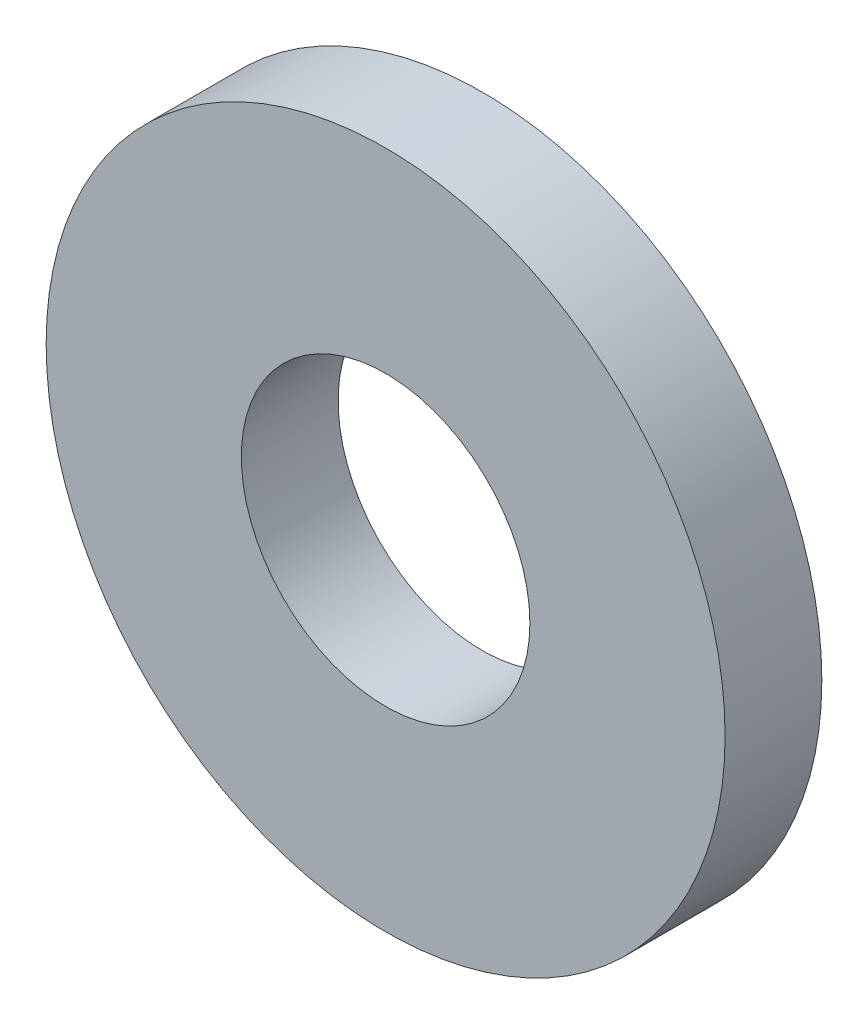
ISO-10303-21;
HEADER;
FILE_DESCRIPTION(('STEP AP214'),'2;1');
FILE_NAME('part.step','',(''),(''),'','','');
FILE_SCHEMA(('AUTOMOTIVE_DESIGN { 1 0 10303 214 1 1 1 1 }'));
ENDSEC;
DATA;
#1=APPLICATION_CONTEXT('core data for automotive mechanical design processes');
#2=APPLICATION_PROTOCOL_DEFINITION('international standard','automotive_design',2000,#1);
#3=PRODUCT_CONTEXT('',#1,'mechanical');
#4=PRODUCT('Part','Part','',(#3));
#5=PRODUCT_RELATED_PRODUCT_CATEGORY('part','',(#4));
#6=PRODUCT_DEFINITION_FORMATION('','',#4);
#7=PRODUCT_DEFINITION_CONTEXT('part definition',#1,'design');
#8=PRODUCT_DEFINITION('design','',#6,#7);
#9=PRODUCT_DEFINITION_SHAPE('','',#8);
#10=(LENGTH_UNIT() NAMED_UNIT(*) SI_UNIT(.MILLI.,.METRE.));
#11=(NAMED_UNIT(*) PLANE_ANGLE_UNIT() SI_UNIT($,.RADIAN.));
#12=(NAMED_UNIT(*) SI_UNIT($,.STERADIAN.) SOLID_ANGLE_UNIT());
#13=UNCERTAINTY_MEASURE_WITH_UNIT(LENGTH_MEASURE(1.E-05),#10,'distance_accuracy_value','');
#14=(GEOMETRIC_REPRESENTATION_CONTEXT(3) GLOBAL_UNCERTAINTY_ASSIGNED_CONTEXT((#13)) GLOBAL_UNIT_ASSIGNED_CONTEXT((#10,
#11,#12)) REPRESENTATION_CONTEXT('',''));
#15=CARTESIAN_POINT('',(0.,0.,0.));
#16=DIRECTION('',(0.,0.,1.));
#17=DIRECTION('',(1.,0.,0.));
#18=AXIS2_PLACEMENT_3D('',#15,#16,#17);
#19=CARTESIAN_POINT('',(0.,0.,2.85));
#20=DIRECTION('',(0.,0.,1.));
#21=DIRECTION('',(1.,0.,0.));
#22=AXIS2_PLACEMENT_3D('',#19,#20,#21);
#23=PLANE('',#22);
#24=CARTESIAN_POINT('',(0.,0.,2.85));
#25=DIRECTION('',(0.,0.,1.));
#26=DIRECTION('',(1.,0.,0.));
#27=AXIS2_PLACEMENT_3D('',#24,#25,#26);
#28=CIRCLE('',#27,20.);
#29=CARTESIAN_POINT('',(20.,0.,2.85));
#30=VERTEX_POINT('',#29);
#31=EDGE_CURVE('E10',#30,#30,#28,.T.);
#32=ORIENTED_EDGE('',*,*,#31,.T.);
#33=EDGE_LOOP('',(#32));
#34=FACE_BOUND('',#33,.T.);
#35=CARTESIAN_POINT('',(0.,0.,2.85));
#36=DIRECTION('',(0.,0.,1.));
#37=DIRECTION('',(1.,0.,0.));
#38=AXIS2_PLACEMENT_3D('',#35,#36,#37);
#39=CIRCLE('',#38,8.5);
#40=CARTESIAN_POINT('',(8.5,0.,2.85));
#41=VERTEX_POINT('',#40);
#42=EDGE_CURVE('E45',#41,#41,#39,.T.);
#43=ORIENTED_EDGE('',*,*,#42,.F.);
#44=EDGE_LOOP('',(#43));
#45=FACE_BOUND('',#44,.T.);
#46=ADVANCED_FACE('F34',(#34,#45),#23,.T.);
#47=CARTESIAN_POINT('',(0.,0.,-2.85));
#48=DIRECTION('',(0.,0.,1.));
#49=DIRECTION('',(1.,0.,0.));
#50=AXIS2_PLACEMENT_3D('',#47,#48,#49);
#51=PLANE('',#50);
#52=CARTESIAN_POINT('',(0.,0.,-2.85));
#53=DIRECTION('',(0.,0.,1.));
#54=DIRECTION('',(1.,0.,0.));
#55=AXIS2_PLACEMENT_3D('',#52,#53,#54);
#56=CIRCLE('',#55,20.);
#57=CARTESIAN_POINT('',(20.,0.,-2.85));
#58=VERTEX_POINT('',#57);
#59=EDGE_CURVE('E38',#58,#58,#56,.T.);
#60=ORIENTED_EDGE('',*,*,#59,.F.);
#61=EDGE_LOOP('',(#60));
#62=FACE_BOUND('',#61,.T.);
#63=CARTESIAN_POINT('',(0.,0.,-2.85));
#64=DIRECTION('',(0.,0.,1.));
#65=DIRECTION('',(1.,0.,0.));
#66=AXIS2_PLACEMENT_3D('',#63,#64,#65);
#67=CIRCLE('',#66,8.5);
#68=CARTESIAN_POINT('',(8.5,0.,-2.85));
#69=VERTEX_POINT('',#68);
#70=EDGE_CURVE('E47',#69,#69,#67,.T.);
#71=ORIENTED_EDGE('',*,*,#70,.T.);
#72=EDGE_LOOP('',(#71));
#73=FACE_BOUND('',#72,.T.);
#74=ADVANCED_FACE('F57',(#62,#73),#51,.F.);
#75=CARTESIAN_POINT('',(0.,0.,2.85));
#76=DIRECTION('',(0.,0.,-1.));
#77=DIRECTION('',(-1.,0.,0.));
#78=AXIS2_PLACEMENT_3D('',#75,#76,#77);
#79=CYLINDRICAL_SURFACE('',#78,20.);
#80=ORIENTED_EDGE('',*,*,#31,.F.);
#81=EDGE_LOOP('',(#80));
#82=FACE_BOUND('',#81,.T.);
#83=ORIENTED_EDGE('',*,*,#59,.T.);
#84=EDGE_LOOP('',(#83));
#85=FACE_BOUND('',#84,.T.);
#86=ADVANCED_FACE('F36',(#82,#85),#79,.T.);
#87=CARTESIAN_POINT('',(0.,0.,2.85));
#88=DIRECTION('',(0.,0.,-1.));
#89=DIRECTION('',(-1.,0.,0.));
#90=AXIS2_PLACEMENT_3D('',#87,#88,#89);
#91=CYLINDRICAL_SURFACE('',#90,8.5);
#92=ORIENTED_EDGE('',*,*,#42,.T.);
#93=EDGE_LOOP('',(#92));
#94=FACE_BOUND('',#93,.T.);
#95=ORIENTED_EDGE('',*,*,#70,.F.);
#96=EDGE_LOOP('',(#95));
#97=FACE_BOUND('',#96,.T.);
#98=ADVANCED_FACE('F53',(#94,#97),#91,.F.);
#99=CLOSED_SHELL('',(#46,#74,#86,#98));
#100=MANIFOLD_SOLID_BREP('B2',#99);
#101=ADVANCED_BREP_SHAPE_REPRESENTATION('',(#18,#100),#14);
#102=SHAPE_DEFINITION_REPRESENTATION(#9,#101);
ENDSEC;
END-ISO-10303-21;
